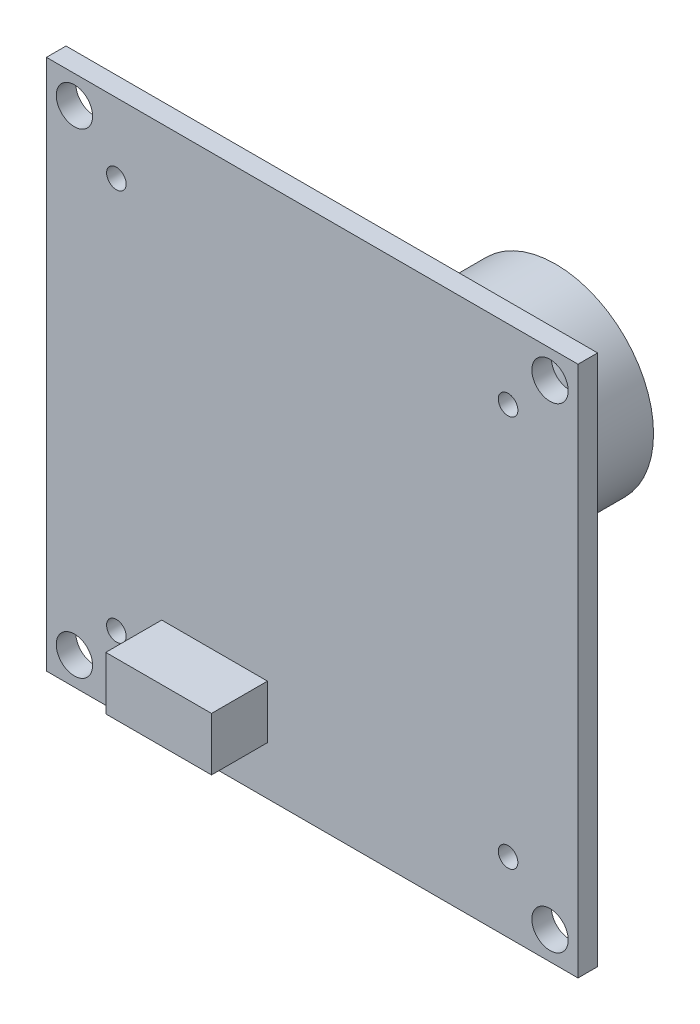
ISO-10303-21;
HEADER;
FILE_DESCRIPTION(('STEP AP214'),'2;1');
FILE_NAME('part.step','',(''),(''),'','','');
FILE_SCHEMA(('AUTOMOTIVE_DESIGN { 1 0 10303 214 1 1 1 1 }'));
ENDSEC;
DATA;
#1=APPLICATION_CONTEXT('core data for automotive mechanical design processes');
#2=APPLICATION_PROTOCOL_DEFINITION('international standard','automotive_design',2000,#1);
#3=PRODUCT_CONTEXT('',#1,'mechanical');
#4=PRODUCT('Part','Part','',(#3));
#5=PRODUCT_RELATED_PRODUCT_CATEGORY('part','',(#4));
#6=PRODUCT_DEFINITION_FORMATION('','',#4);
#7=PRODUCT_DEFINITION_CONTEXT('part definition',#1,'design');
#8=PRODUCT_DEFINITION('design','',#6,#7);
#9=PRODUCT_DEFINITION_SHAPE('','',#8);
#10=(LENGTH_UNIT() NAMED_UNIT(*) SI_UNIT(.MILLI.,.METRE.));
#11=(NAMED_UNIT(*) PLANE_ANGLE_UNIT() SI_UNIT($,.RADIAN.));
#12=(NAMED_UNIT(*) SI_UNIT($,.STERADIAN.) SOLID_ANGLE_UNIT());
#13=UNCERTAINTY_MEASURE_WITH_UNIT(LENGTH_MEASURE(1.E-05),#10,'distance_accuracy_value','');
#14=(GEOMETRIC_REPRESENTATION_CONTEXT(3) GLOBAL_UNCERTAINTY_ASSIGNED_CONTEXT((#13)) GLOBAL_UNIT_ASSIGNED_CONTEXT((#10,
#11,#12)) REPRESENTATION_CONTEXT('',''));
#15=CARTESIAN_POINT('',(0.,0.,0.));
#16=DIRECTION('',(0.,0.,1.));
#17=DIRECTION('',(1.,0.,0.));
#18=AXIS2_PLACEMENT_3D('',#15,#16,#17);
#19=CARTESIAN_POINT('',(0.,0.,1.4));
#20=DIRECTION('',(0.,0.,1.));
#21=DIRECTION('',(1.,0.,0.));
#22=AXIS2_PLACEMENT_3D('',#19,#20,#21);
#23=PLANE('',#22);
#24=CARTESIAN_POINT('',(-3.,-3.,1.4));
#25=DIRECTION('',(0.,0.,1.));
#26=DIRECTION('',(1.,0.,0.));
#27=AXIS2_PLACEMENT_3D('',#24,#25,#26);
#28=CIRCLE('',#27,1.3);
#29=CARTESIAN_POINT('',(-1.7,-3.,1.4));
#30=VERTEX_POINT('',#29);
#31=EDGE_CURVE('E136',#30,#30,#28,.T.);
#32=ORIENTED_EDGE('',*,*,#31,.F.);
#33=EDGE_LOOP('',(#32));
#34=FACE_BOUND('',#33,.T.);
#35=CARTESIAN_POINT('',(31.,-3.,1.4));
#36=DIRECTION('',(0.,0.,1.));
#37=DIRECTION('',(1.,0.,0.));
#38=AXIS2_PLACEMENT_3D('',#35,#36,#37);
#39=CIRCLE('',#38,1.3);
#40=CARTESIAN_POINT('',(32.3,-3.,1.4));
#41=VERTEX_POINT('',#40);
#42=EDGE_CURVE('E139',#41,#41,#39,.T.);
#43=ORIENTED_EDGE('',*,*,#42,.F.);
#44=EDGE_LOOP('',(#43));
#45=FACE_BOUND('',#44,.T.);
#46=CARTESIAN_POINT('',(31.,31.,1.4));
#47=DIRECTION('',(0.,0.,1.));
#48=DIRECTION('',(1.,0.,0.));
#49=AXIS2_PLACEMENT_3D('',#46,#47,#48);
#50=CIRCLE('',#49,1.3);
#51=CARTESIAN_POINT('',(32.3,31.,1.4));
#52=VERTEX_POINT('',#51);
#53=EDGE_CURVE('E143',#52,#52,#50,.T.);
#54=ORIENTED_EDGE('',*,*,#53,.F.);
#55=EDGE_LOOP('',(#54));
#56=FACE_BOUND('',#55,.T.);
#57=CARTESIAN_POINT('',(-3.,31.,1.4));
#58=DIRECTION('',(0.,0.,1.));
#59=DIRECTION('',(1.,0.,0.));
#60=AXIS2_PLACEMENT_3D('',#57,#58,#59);
#61=CIRCLE('',#60,1.3);
#62=CARTESIAN_POINT('',(-1.7,31.,1.4));
#63=VERTEX_POINT('',#62);
#64=EDGE_CURVE('E146',#63,#63,#61,.T.);
#65=ORIENTED_EDGE('',*,*,#64,.F.);
#66=EDGE_LOOP('',(#65));
#67=FACE_BOUND('',#66,.T.);
#68=DIRECTION('',(0.,-1.,0.));
#69=VECTOR('',#68,1.);
#70=CARTESIAN_POINT('',(33.,0.,1.4));
#71=LINE('',#70,#69);
#72=CARTESIAN_POINT('',(33.,33.,1.4));
#73=VERTEX_POINT('',#72);
#74=CARTESIAN_POINT('',(33.,-5.,1.4));
#75=VERTEX_POINT('',#74);
#76=EDGE_CURVE('E149',#73,#75,#71,.T.);
#77=ORIENTED_EDGE('',*,*,#76,.F.);
#78=DIRECTION('',(1.,0.,0.));
#79=VECTOR('',#78,1.);
#80=CARTESIAN_POINT('',(0.,33.,1.4));
#81=LINE('',#80,#79);
#82=CARTESIAN_POINT('',(-4.99999999999999,33.,1.4));
#83=VERTEX_POINT('',#82);
#84=EDGE_CURVE('E152',#83,#73,#81,.T.);
#85=ORIENTED_EDGE('',*,*,#84,.F.);
#86=DIRECTION('',(0.,-1.,0.));
#87=VECTOR('',#86,1.);
#88=CARTESIAN_POINT('',(-4.99999999999999,0.,1.4));
#89=LINE('',#88,#87);
#90=CARTESIAN_POINT('',(-4.99999999999999,-5.,1.4));
#91=VERTEX_POINT('',#90);
#92=EDGE_CURVE('E155',#83,#91,#89,.T.);
#93=ORIENTED_EDGE('',*,*,#92,.T.);
#94=DIRECTION('',(1.,0.,0.));
#95=VECTOR('',#94,1.);
#96=CARTESIAN_POINT('',(0.,-5.,1.4));
#97=LINE('',#96,#95);
#98=EDGE_CURVE('E158',#91,#75,#97,.T.);
#99=ORIENTED_EDGE('',*,*,#98,.T.);
#100=EDGE_LOOP('',(#77,#85,#93,#99));
#101=FACE_BOUND('',#100,.T.);
#102=CARTESIAN_POINT('',(0.,28.,1.4));
#103=DIRECTION('',(0.,0.,1.));
#104=DIRECTION('',(1.,0.,0.));
#105=AXIS2_PLACEMENT_3D('',#102,#103,#104);
#106=CIRCLE('',#105,0.7);
#107=CARTESIAN_POINT('',(0.7,28.,1.4));
#108=VERTEX_POINT('',#107);
#109=EDGE_CURVE('E160',#108,#108,#106,.T.);
#110=ORIENTED_EDGE('',*,*,#109,.F.);
#111=EDGE_LOOP('',(#110));
#112=FACE_BOUND('',#111,.T.);
#113=CARTESIAN_POINT('',(28.,28.,1.4));
#114=DIRECTION('',(0.,0.,1.));
#115=DIRECTION('',(1.,0.,0.));
#116=AXIS2_PLACEMENT_3D('',#113,#114,#115);
#117=CIRCLE('',#116,0.699999999999998);
#118=CARTESIAN_POINT('',(28.7,28.,1.4));
#119=VERTEX_POINT('',#118);
#120=EDGE_CURVE('E163',#119,#119,#117,.T.);
#121=ORIENTED_EDGE('',*,*,#120,.F.);
#122=EDGE_LOOP('',(#121));
#123=FACE_BOUND('',#122,.T.);
#124=CARTESIAN_POINT('',(0.,0.,1.4));
#125=DIRECTION('',(0.,0.,1.));
#126=DIRECTION('',(1.,0.,0.));
#127=AXIS2_PLACEMENT_3D('',#124,#125,#126);
#128=CIRCLE('',#127,0.7);
#129=CARTESIAN_POINT('',(0.7,0.,1.4));
#130=VERTEX_POINT('',#129);
#131=EDGE_CURVE('E166',#130,#130,#128,.T.);
#132=ORIENTED_EDGE('',*,*,#131,.F.);
#133=EDGE_LOOP('',(#132));
#134=FACE_BOUND('',#133,.T.);
#135=CARTESIAN_POINT('',(28.,0.,1.4));
#136=DIRECTION('',(0.,0.,1.));
#137=DIRECTION('',(1.,0.,0.));
#138=AXIS2_PLACEMENT_3D('',#135,#136,#137);
#139=CIRCLE('',#138,0.699999999999998);
#140=CARTESIAN_POINT('',(28.7,0.,1.4));
#141=VERTEX_POINT('',#140);
#142=EDGE_CURVE('E169',#141,#141,#139,.T.);
#143=ORIENTED_EDGE('',*,*,#142,.F.);
#144=EDGE_LOOP('',(#143));
#145=FACE_BOUND('',#144,.T.);
#146=DIRECTION('',(1.,0.,0.));
#147=VECTOR('',#146,1.);
#148=CARTESIAN_POINT('',(3.24000000000001,-1.53,1.4));
#149=LINE('',#148,#147);
#150=CARTESIAN_POINT('',(3.24000000000001,-1.53,1.4));
#151=VERTEX_POINT('',#150);
#152=CARTESIAN_POINT('',(10.8,-1.53,1.4));
#153=VERTEX_POINT('',#152);
#154=EDGE_CURVE('E55',#151,#153,#149,.T.);
#155=ORIENTED_EDGE('',*,*,#154,.F.);
#156=DIRECTION('',(0.,-1.,0.));
#157=VECTOR('',#156,1.);
#158=CARTESIAN_POINT('',(3.24000000000001,2.28,1.4));
#159=LINE('',#158,#157);
#160=CARTESIAN_POINT('',(3.24000000000001,2.28,1.4));
#161=VERTEX_POINT('',#160);
#162=EDGE_CURVE('E126',#161,#151,#159,.T.);
#163=ORIENTED_EDGE('',*,*,#162,.F.);
#164=DIRECTION('',(1.,0.,0.));
#165=VECTOR('',#164,1.);
#166=CARTESIAN_POINT('',(3.24000000000001,2.28,1.4));
#167=LINE('',#166,#165);
#168=CARTESIAN_POINT('',(10.8,2.28,1.4));
#169=VERTEX_POINT('',#168);
#170=EDGE_CURVE('E123',#161,#169,#167,.T.);
#171=ORIENTED_EDGE('',*,*,#170,.T.);
#172=DIRECTION('',(0.,-1.,0.));
#173=VECTOR('',#172,1.);
#174=CARTESIAN_POINT('',(10.8,2.28,1.4));
#175=LINE('',#174,#173);
#176=EDGE_CURVE('E60',#169,#153,#175,.T.);
#177=ORIENTED_EDGE('',*,*,#176,.T.);
#178=EDGE_LOOP('',(#155,#163,#171,#177));
#179=FACE_BOUND('',#178,.T.);
#180=ADVANCED_FACE('F40',(#34,#45,#56,#67,#101,#112,#123,#134,#145,#179),#23,.T.);
#181=CARTESIAN_POINT('',(33.,0.,1.4));
#182=DIRECTION('',(1.,0.,0.));
#183=DIRECTION('',(0.,0.,-1.));
#184=AXIS2_PLACEMENT_3D('',#181,#182,#183);
#185=PLANE('',#184);
#186=DIRECTION('',(0.,-1.,0.));
#187=VECTOR('',#186,1.);
#188=CARTESIAN_POINT('',(33.,0.,0.));
#189=LINE('',#188,#187);
#190=CARTESIAN_POINT('',(33.,33.,0.));
#191=VERTEX_POINT('',#190);
#192=CARTESIAN_POINT('',(33.,-5.,0.));
#193=VERTEX_POINT('',#192);
#194=EDGE_CURVE('E181',#191,#193,#189,.T.);
#195=ORIENTED_EDGE('',*,*,#194,.F.);
#196=DIRECTION('',(0.,0.,-1.));
#197=VECTOR('',#196,1.);
#198=CARTESIAN_POINT('',(33.,33.,1.4));
#199=LINE('',#198,#197);
#200=EDGE_CURVE('E48',#73,#191,#199,.T.);
#201=ORIENTED_EDGE('',*,*,#200,.F.);
#202=ORIENTED_EDGE('',*,*,#76,.T.);
#203=DIRECTION('',(0.,0.,-1.));
#204=VECTOR('',#203,1.);
#205=CARTESIAN_POINT('',(33.,-5.,1.4));
#206=LINE('',#205,#204);
#207=EDGE_CURVE('E171',#75,#193,#206,.T.);
#208=ORIENTED_EDGE('',*,*,#207,.T.);
#209=EDGE_LOOP('',(#195,#201,#202,#208));
#210=FACE_BOUND('',#209,.T.);
#211=ADVANCED_FACE('F216',(#210),#185,.T.);
#212=CARTESIAN_POINT('',(0.,33.,1.4));
#213=DIRECTION('',(0.,1.,0.));
#214=DIRECTION('',(0.,0.,1.));
#215=AXIS2_PLACEMENT_3D('',#212,#213,#214);
#216=PLANE('',#215);
#217=DIRECTION('',(1.,0.,0.));
#218=VECTOR('',#217,1.);
#219=CARTESIAN_POINT('',(0.,33.,0.));
#220=LINE('',#219,#218);
#221=CARTESIAN_POINT('',(-4.99999999999999,33.,0.));
#222=VERTEX_POINT('',#221);
#223=EDGE_CURVE('E184',#222,#191,#220,.T.);
#224=ORIENTED_EDGE('',*,*,#223,.F.);
#225=DIRECTION('',(0.,0.,-1.));
#226=VECTOR('',#225,1.);
#227=CARTESIAN_POINT('',(-4.99999999999999,33.,1.4));
#228=LINE('',#227,#226);
#229=EDGE_CURVE('E208',#83,#222,#228,.T.);
#230=ORIENTED_EDGE('',*,*,#229,.F.);
#231=ORIENTED_EDGE('',*,*,#84,.T.);
#232=ORIENTED_EDGE('',*,*,#200,.T.);
#233=EDGE_LOOP('',(#224,#230,#231,#232));
#234=FACE_BOUND('',#233,.T.);
#235=ADVANCED_FACE('F212',(#234),#216,.T.);
#236=CARTESIAN_POINT('',(-4.99999999999999,0.,1.4));
#237=DIRECTION('',(1.,0.,0.));
#238=DIRECTION('',(0.,0.,-1.));
#239=AXIS2_PLACEMENT_3D('',#236,#237,#238);
#240=PLANE('',#239);
#241=DIRECTION('',(0.,-1.,0.));
#242=VECTOR('',#241,1.);
#243=CARTESIAN_POINT('',(-4.99999999999999,0.,0.));
#244=LINE('',#243,#242);
#245=CARTESIAN_POINT('',(-4.99999999999999,-5.,0.));
#246=VERTEX_POINT('',#245);
#247=EDGE_CURVE('E187',#222,#246,#244,.T.);
#248=ORIENTED_EDGE('',*,*,#247,.T.);
#249=DIRECTION('',(0.,0.,-1.));
#250=VECTOR('',#249,1.);
#251=CARTESIAN_POINT('',(-4.99999999999999,-5.,1.4));
#252=LINE('',#251,#250);
#253=EDGE_CURVE('E205',#91,#246,#252,.T.);
#254=ORIENTED_EDGE('',*,*,#253,.F.);
#255=ORIENTED_EDGE('',*,*,#92,.F.);
#256=ORIENTED_EDGE('',*,*,#229,.T.);
#257=EDGE_LOOP('',(#248,#254,#255,#256));
#258=FACE_BOUND('',#257,.T.);
#259=ADVANCED_FACE('F224',(#258),#240,.F.);
#260=CARTESIAN_POINT('',(0.,0.,1.4));
#261=DIRECTION('',(0.,0.,-1.));
#262=DIRECTION('',(-1.,0.,0.));
#263=AXIS2_PLACEMENT_3D('',#260,#261,#262);
#264=CYLINDRICAL_SURFACE('',#263,0.7);
#265=ORIENTED_EDGE('',*,*,#131,.T.);
#266=EDGE_LOOP('',(#265));
#267=FACE_BOUND('',#266,.T.);
#268=CARTESIAN_POINT('',(0.,0.,0.));
#269=DIRECTION('',(0.,0.,1.));
#270=DIRECTION('',(1.,0.,0.));
#271=AXIS2_PLACEMENT_3D('',#268,#269,#270);
#272=CIRCLE('',#271,0.7);
#273=CARTESIAN_POINT('',(0.7,0.,0.));
#274=VERTEX_POINT('',#273);
#275=EDGE_CURVE('E199',#274,#274,#272,.T.);
#276=ORIENTED_EDGE('',*,*,#275,.F.);
#277=EDGE_LOOP('',(#276));
#278=FACE_BOUND('',#277,.T.);
#279=ADVANCED_FACE('F264',(#267,#278),#264,.F.);
#280=CARTESIAN_POINT('',(28.,28.,1.4));
#281=DIRECTION('',(0.,0.,-1.));
#282=DIRECTION('',(-1.,0.,0.));
#283=AXIS2_PLACEMENT_3D('',#280,#281,#282);
#284=CYLINDRICAL_SURFACE('',#283,0.699999999999998);
#285=ORIENTED_EDGE('',*,*,#120,.T.);
#286=EDGE_LOOP('',(#285));
#287=FACE_BOUND('',#286,.T.);
#288=CARTESIAN_POINT('',(28.,28.,0.));
#289=DIRECTION('',(0.,0.,1.));
#290=DIRECTION('',(1.,0.,0.));
#291=AXIS2_PLACEMENT_3D('',#288,#289,#290);
#292=CIRCLE('',#291,0.699999999999998);
#293=CARTESIAN_POINT('',(28.7,28.,0.));
#294=VERTEX_POINT('',#293);
#295=EDGE_CURVE('E196',#294,#294,#292,.T.);
#296=ORIENTED_EDGE('',*,*,#295,.F.);
#297=EDGE_LOOP('',(#296));
#298=FACE_BOUND('',#297,.T.);
#299=ADVANCED_FACE('F241',(#287,#298),#284,.F.);
#300=CARTESIAN_POINT('',(0.,28.,1.4));
#301=DIRECTION('',(0.,0.,-1.));
#302=DIRECTION('',(-1.,0.,0.));
#303=AXIS2_PLACEMENT_3D('',#300,#301,#302);
#304=CYLINDRICAL_SURFACE('',#303,0.7);
#305=ORIENTED_EDGE('',*,*,#109,.T.);
#306=EDGE_LOOP('',(#305));
#307=FACE_BOUND('',#306,.T.);
#308=CARTESIAN_POINT('',(0.,28.,0.));
#309=DIRECTION('',(0.,0.,1.));
#310=DIRECTION('',(1.,0.,0.));
#311=AXIS2_PLACEMENT_3D('',#308,#309,#310);
#312=CIRCLE('',#311,0.7);
#313=CARTESIAN_POINT('',(0.7,28.,0.));
#314=VERTEX_POINT('',#313);
#315=EDGE_CURVE('E193',#314,#314,#312,.T.);
#316=ORIENTED_EDGE('',*,*,#315,.F.);
#317=EDGE_LOOP('',(#316));
#318=FACE_BOUND('',#317,.T.);
#319=ADVANCED_FACE('F232',(#307,#318),#304,.F.);
#320=CARTESIAN_POINT('',(0.,-5.,1.4));
#321=DIRECTION('',(0.,1.,0.));
#322=DIRECTION('',(0.,0.,1.));
#323=AXIS2_PLACEMENT_3D('',#320,#321,#322);
#324=PLANE('',#323);
#325=DIRECTION('',(1.,0.,0.));
#326=VECTOR('',#325,1.);
#327=CARTESIAN_POINT('',(0.,-5.,0.));
#328=LINE('',#327,#326);
#329=EDGE_CURVE('E190',#246,#193,#328,.T.);
#330=ORIENTED_EDGE('',*,*,#329,.T.);
#331=ORIENTED_EDGE('',*,*,#207,.F.);
#332=ORIENTED_EDGE('',*,*,#98,.F.);
#333=ORIENTED_EDGE('',*,*,#253,.T.);
#334=EDGE_LOOP('',(#330,#331,#332,#333));
#335=FACE_BOUND('',#334,.T.);
#336=ADVANCED_FACE('F229',(#335),#324,.F.);
#337=CARTESIAN_POINT('',(-3.,31.,1.4));
#338=DIRECTION('',(0.,0.,-1.));
#339=DIRECTION('',(-1.,0.,0.));
#340=AXIS2_PLACEMENT_3D('',#337,#338,#339);
#341=CYLINDRICAL_SURFACE('',#340,1.3);
#342=ORIENTED_EDGE('',*,*,#64,.T.);
#343=EDGE_LOOP('',(#342));
#344=FACE_BOUND('',#343,.T.);
#345=CARTESIAN_POINT('',(-3.,31.,0.));
#346=DIRECTION('',(0.,0.,1.));
#347=DIRECTION('',(1.,0.,0.));
#348=AXIS2_PLACEMENT_3D('',#345,#346,#347);
#349=CIRCLE('',#348,1.3);
#350=CARTESIAN_POINT('',(-1.7,31.,0.));
#351=VERTEX_POINT('',#350);
#352=EDGE_CURVE('E178',#351,#351,#349,.T.);
#353=ORIENTED_EDGE('',*,*,#352,.F.);
#354=EDGE_LOOP('',(#353));
#355=FACE_BOUND('',#354,.T.);
#356=ADVANCED_FACE('F231',(#344,#355),#341,.F.);
#357=CARTESIAN_POINT('',(31.,31.,1.4));
#358=DIRECTION('',(0.,0.,-1.));
#359=DIRECTION('',(-1.,0.,0.));
#360=AXIS2_PLACEMENT_3D('',#357,#358,#359);
#361=CYLINDRICAL_SURFACE('',#360,1.3);
#362=ORIENTED_EDGE('',*,*,#53,.T.);
#363=EDGE_LOOP('',(#362));
#364=FACE_BOUND('',#363,.T.);
#365=CARTESIAN_POINT('',(31.,31.,0.));
#366=DIRECTION('',(0.,0.,1.));
#367=DIRECTION('',(1.,0.,0.));
#368=AXIS2_PLACEMENT_3D('',#365,#366,#367);
#369=CIRCLE('',#368,1.3);
#370=CARTESIAN_POINT('',(32.3,31.,0.));
#371=VERTEX_POINT('',#370);
#372=EDGE_CURVE('E175',#371,#371,#369,.T.);
#373=ORIENTED_EDGE('',*,*,#372,.F.);
#374=EDGE_LOOP('',(#373));
#375=FACE_BOUND('',#374,.T.);
#376=ADVANCED_FACE('F238',(#364,#375),#361,.F.);
#377=CARTESIAN_POINT('',(31.,-3.,1.4));
#378=DIRECTION('',(0.,0.,-1.));
#379=DIRECTION('',(-1.,0.,0.));
#380=AXIS2_PLACEMENT_3D('',#377,#378,#379);
#381=CYLINDRICAL_SURFACE('',#380,1.3);
#382=ORIENTED_EDGE('',*,*,#42,.T.);
#383=EDGE_LOOP('',(#382));
#384=FACE_BOUND('',#383,.T.);
#385=CARTESIAN_POINT('',(31.,-3.,0.));
#386=DIRECTION('',(0.,0.,1.));
#387=DIRECTION('',(1.,0.,0.));
#388=AXIS2_PLACEMENT_3D('',#385,#386,#387);
#389=CIRCLE('',#388,1.3);
#390=CARTESIAN_POINT('',(32.3,-3.,0.));
#391=VERTEX_POINT('',#390);
#392=EDGE_CURVE('E130',#391,#391,#389,.T.);
#393=ORIENTED_EDGE('',*,*,#392,.F.);
#394=EDGE_LOOP('',(#393));
#395=FACE_BOUND('',#394,.T.);
#396=ADVANCED_FACE('F316',(#384,#395),#381,.F.);
#397=CARTESIAN_POINT('',(-3.,-3.,1.4));
#398=DIRECTION('',(0.,0.,-1.));
#399=DIRECTION('',(-1.,0.,0.));
#400=AXIS2_PLACEMENT_3D('',#397,#398,#399);
#401=CYLINDRICAL_SURFACE('',#400,1.3);
#402=ORIENTED_EDGE('',*,*,#31,.T.);
#403=EDGE_LOOP('',(#402));
#404=FACE_BOUND('',#403,.T.);
#405=CARTESIAN_POINT('',(-3.,-3.,0.));
#406=DIRECTION('',(0.,0.,1.));
#407=DIRECTION('',(1.,0.,0.));
#408=AXIS2_PLACEMENT_3D('',#405,#406,#407);
#409=CIRCLE('',#408,1.3);
#410=CARTESIAN_POINT('',(-1.7,-3.,0.));
#411=VERTEX_POINT('',#410);
#412=EDGE_CURVE('E127',#411,#411,#409,.T.);
#413=ORIENTED_EDGE('',*,*,#412,.F.);
#414=EDGE_LOOP('',(#413));
#415=FACE_BOUND('',#414,.T.);
#416=ADVANCED_FACE('F42',(#404,#415),#401,.F.);
#417=CARTESIAN_POINT('',(28.,0.,1.4));
#418=DIRECTION('',(0.,0.,-1.));
#419=DIRECTION('',(-1.,0.,0.));
#420=AXIS2_PLACEMENT_3D('',#417,#418,#419);
#421=CYLINDRICAL_SURFACE('',#420,0.699999999999998);
#422=ORIENTED_EDGE('',*,*,#142,.T.);
#423=EDGE_LOOP('',(#422));
#424=FACE_BOUND('',#423,.T.);
#425=CARTESIAN_POINT('',(28.,0.,0.));
#426=DIRECTION('',(0.,0.,1.));
#427=DIRECTION('',(1.,0.,0.));
#428=AXIS2_PLACEMENT_3D('',#425,#426,#427);
#429=CIRCLE('',#428,0.699999999999998);
#430=CARTESIAN_POINT('',(28.7,0.,0.));
#431=VERTEX_POINT('',#430);
#432=EDGE_CURVE('E140',#431,#431,#429,.T.);
#433=ORIENTED_EDGE('',*,*,#432,.F.);
#434=EDGE_LOOP('',(#433));
#435=FACE_BOUND('',#434,.T.);
#436=ADVANCED_FACE('F259',(#424,#435),#421,.F.);
#437=CARTESIAN_POINT('',(0.,0.,0.));
#438=DIRECTION('',(0.,0.,1.));
#439=DIRECTION('',(1.,0.,0.));
#440=AXIS2_PLACEMENT_3D('',#437,#438,#439);
#441=PLANE('',#440);
#442=CARTESIAN_POINT('',(14.,14.,0.));
#443=DIRECTION('',(0.,0.,1.));
#444=DIRECTION('',(1.,0.,0.));
#445=AXIS2_PLACEMENT_3D('',#442,#443,#444);
#446=CIRCLE('',#445,7.);
#447=CARTESIAN_POINT('',(21.,14.,0.));
#448=VERTEX_POINT('',#447);
#449=EDGE_CURVE('E11',#448,#448,#446,.F.);
#450=ORIENTED_EDGE('',*,*,#449,.F.);
#451=EDGE_LOOP('',(#450));
#452=FACE_BOUND('',#451,.T.);
#453=ORIENTED_EDGE('',*,*,#412,.T.);
#454=EDGE_LOOP('',(#453));
#455=FACE_BOUND('',#454,.T.);
#456=ORIENTED_EDGE('',*,*,#392,.T.);
#457=EDGE_LOOP('',(#456));
#458=FACE_BOUND('',#457,.T.);
#459=ORIENTED_EDGE('',*,*,#372,.T.);
#460=EDGE_LOOP('',(#459));
#461=FACE_BOUND('',#460,.T.);
#462=ORIENTED_EDGE('',*,*,#352,.T.);
#463=EDGE_LOOP('',(#462));
#464=FACE_BOUND('',#463,.T.);
#465=ORIENTED_EDGE('',*,*,#194,.T.);
#466=ORIENTED_EDGE('',*,*,#329,.F.);
#467=ORIENTED_EDGE('',*,*,#247,.F.);
#468=ORIENTED_EDGE('',*,*,#223,.T.);
#469=EDGE_LOOP('',(#465,#466,#467,#468));
#470=FACE_BOUND('',#469,.T.);
#471=ORIENTED_EDGE('',*,*,#315,.T.);
#472=EDGE_LOOP('',(#471));
#473=FACE_BOUND('',#472,.T.);
#474=ORIENTED_EDGE('',*,*,#295,.T.);
#475=EDGE_LOOP('',(#474));
#476=FACE_BOUND('',#475,.T.);
#477=ORIENTED_EDGE('',*,*,#275,.T.);
#478=EDGE_LOOP('',(#477));
#479=FACE_BOUND('',#478,.T.);
#480=ORIENTED_EDGE('',*,*,#432,.T.);
#481=EDGE_LOOP('',(#480));
#482=FACE_BOUND('',#481,.T.);
#483=ADVANCED_FACE('F220',(#452,#455,#458,#461,#464,#470,#473,#476,#479,#482),#441,.F.);
#484=CARTESIAN_POINT('',(3.24000000000001,2.28,5.4));
#485=DIRECTION('',(1.,0.,0.));
#486=DIRECTION('',(0.,1.,0.));
#487=AXIS2_PLACEMENT_3D('',#484,#485,#486);
#488=PLANE('',#487);
#489=ORIENTED_EDGE('',*,*,#162,.T.);
#490=DIRECTION('',(0.,0.,-1.));
#491=VECTOR('',#490,1.);
#492=CARTESIAN_POINT('',(3.24000000000001,-1.53,5.4));
#493=LINE('',#492,#491);
#494=CARTESIAN_POINT('',(3.24000000000001,-1.53,5.4));
#495=VERTEX_POINT('',#494);
#496=EDGE_CURVE('E107',#495,#151,#493,.T.);
#497=ORIENTED_EDGE('',*,*,#496,.F.);
#498=DIRECTION('',(0.,-1.,0.));
#499=VECTOR('',#498,1.);
#500=CARTESIAN_POINT('',(3.24000000000001,2.28,5.4));
#501=LINE('',#500,#499);
#502=CARTESIAN_POINT('',(3.24000000000001,2.28,5.4));
#503=VERTEX_POINT('',#502);
#504=EDGE_CURVE('E114',#503,#495,#501,.T.);
#505=ORIENTED_EDGE('',*,*,#504,.F.);
#506=DIRECTION('',(0.,0.,-1.));
#507=VECTOR('',#506,1.);
#508=CARTESIAN_POINT('',(3.24000000000001,2.28,5.4));
#509=LINE('',#508,#507);
#510=EDGE_CURVE('E443',#503,#161,#509,.T.);
#511=ORIENTED_EDGE('',*,*,#510,.T.);
#512=EDGE_LOOP('',(#489,#497,#505,#511));
#513=FACE_BOUND('',#512,.T.);
#514=ADVANCED_FACE('F125',(#513),#488,.F.);
#515=CARTESIAN_POINT('',(3.24000000000001,-1.53,5.4));
#516=DIRECTION('',(0.,1.,0.));
#517=DIRECTION('',(0.,0.,1.));
#518=AXIS2_PLACEMENT_3D('',#515,#516,#517);
#519=PLANE('',#518);
#520=ORIENTED_EDGE('',*,*,#154,.T.);
#521=DIRECTION('',(0.,0.,-1.));
#522=VECTOR('',#521,1.);
#523=CARTESIAN_POINT('',(10.8,-1.53,5.4));
#524=LINE('',#523,#522);
#525=CARTESIAN_POINT('',(10.8,-1.53,5.4));
#526=VERTEX_POINT('',#525);
#527=EDGE_CURVE('E109',#526,#153,#524,.T.);
#528=ORIENTED_EDGE('',*,*,#527,.F.);
#529=DIRECTION('',(1.,0.,0.));
#530=VECTOR('',#529,1.);
#531=CARTESIAN_POINT('',(3.24000000000001,-1.53,5.4));
#532=LINE('',#531,#530);
#533=EDGE_CURVE('E103',#495,#526,#532,.T.);
#534=ORIENTED_EDGE('',*,*,#533,.F.);
#535=ORIENTED_EDGE('',*,*,#496,.T.);
#536=EDGE_LOOP('',(#520,#528,#534,#535));
#537=FACE_BOUND('',#536,.T.);
#538=ADVANCED_FACE('F105',(#537),#519,.F.);
#539=CARTESIAN_POINT('',(10.8,2.28,5.4));
#540=DIRECTION('',(1.,0.,0.));
#541=DIRECTION('',(0.,0.,-1.));
#542=AXIS2_PLACEMENT_3D('',#539,#540,#541);
#543=PLANE('',#542);
#544=ORIENTED_EDGE('',*,*,#176,.F.);
#545=DIRECTION('',(0.,0.,-1.));
#546=VECTOR('',#545,1.);
#547=CARTESIAN_POINT('',(10.8,2.28,5.4));
#548=LINE('',#547,#546);
#549=CARTESIAN_POINT('',(10.8,2.28,5.4));
#550=VERTEX_POINT('',#549);
#551=EDGE_CURVE('E132',#550,#169,#548,.T.);
#552=ORIENTED_EDGE('',*,*,#551,.F.);
#553=DIRECTION('',(0.,-1.,0.));
#554=VECTOR('',#553,1.);
#555=CARTESIAN_POINT('',(10.8,2.28,5.4));
#556=LINE('',#555,#554);
#557=EDGE_CURVE('E113',#550,#526,#556,.T.);
#558=ORIENTED_EDGE('',*,*,#557,.T.);
#559=ORIENTED_EDGE('',*,*,#527,.T.);
#560=EDGE_LOOP('',(#544,#552,#558,#559));
#561=FACE_BOUND('',#560,.T.);
#562=ADVANCED_FACE('F366',(#561),#543,.T.);
#563=CARTESIAN_POINT('',(3.24000000000001,2.28,5.4));
#564=DIRECTION('',(0.,1.,0.));
#565=DIRECTION('',(-1.,0.,0.));
#566=AXIS2_PLACEMENT_3D('',#563,#564,#565);
#567=PLANE('',#566);
#568=ORIENTED_EDGE('',*,*,#170,.F.);
#569=ORIENTED_EDGE('',*,*,#510,.F.);
#570=DIRECTION('',(1.,0.,0.));
#571=VECTOR('',#570,1.);
#572=CARTESIAN_POINT('',(3.24000000000001,2.28,5.4));
#573=LINE('',#572,#571);
#574=EDGE_CURVE('E120',#503,#550,#573,.T.);
#575=ORIENTED_EDGE('',*,*,#574,.T.);
#576=ORIENTED_EDGE('',*,*,#551,.T.);
#577=EDGE_LOOP('',(#568,#569,#575,#576));
#578=FACE_BOUND('',#577,.T.);
#579=ADVANCED_FACE('F375',(#578),#567,.T.);
#580=CARTESIAN_POINT('',(0.,0.,5.4));
#581=DIRECTION('',(0.,0.,1.));
#582=DIRECTION('',(1.,0.,0.));
#583=AXIS2_PLACEMENT_3D('',#580,#581,#582);
#584=PLANE('',#583);
#585=ORIENTED_EDGE('',*,*,#504,.T.);
#586=ORIENTED_EDGE('',*,*,#533,.T.);
#587=ORIENTED_EDGE('',*,*,#557,.F.);
#588=ORIENTED_EDGE('',*,*,#574,.F.);
#589=EDGE_LOOP('',(#585,#586,#587,#588));
#590=FACE_BOUND('',#589,.T.);
#591=ADVANCED_FACE('F118',(#590),#584,.T.);
#592=CARTESIAN_POINT('',(14.,14.,-16.));
#593=DIRECTION('',(0.,0.,1.));
#594=DIRECTION('',(1.,0.,0.));
#595=AXIS2_PLACEMENT_3D('',#592,#593,#594);
#596=CYLINDRICAL_SURFACE('',#595,7.);
#597=CARTESIAN_POINT('',(14.,14.,-16.));
#598=DIRECTION('',(0.,0.,-1.));
#599=DIRECTION('',(-1.,0.,0.));
#600=AXIS2_PLACEMENT_3D('',#597,#598,#599);
#601=CIRCLE('',#600,7.);
#602=CARTESIAN_POINT('',(7.00000000000001,14.,-16.));
#603=VERTEX_POINT('',#602);
#604=EDGE_CURVE('E438',#603,#603,#601,.T.);
#605=ORIENTED_EDGE('',*,*,#604,.F.);
#606=EDGE_LOOP('',(#605));
#607=FACE_BOUND('',#606,.T.);
#608=ORIENTED_EDGE('',*,*,#449,.T.);
#609=EDGE_LOOP('',(#608));
#610=FACE_BOUND('',#609,.T.);
#611=ADVANCED_FACE('F396',(#607,#610),#596,.T.);
#612=CARTESIAN_POINT('',(14.,14.,-16.));
#613=DIRECTION('',(0.,0.,-1.));
#614=DIRECTION('',(-1.,0.,0.));
#615=AXIS2_PLACEMENT_3D('',#612,#613,#614);
#616=PLANE('',#615);
#617=ORIENTED_EDGE('',*,*,#604,.T.);
#618=EDGE_LOOP('',(#617));
#619=FACE_BOUND('',#618,.T.);
#620=ADVANCED_FACE('F413',(#619),#616,.T.);
#621=CLOSED_SHELL('',(#180,#211,#235,#259,#279,#299,#319,#336,#356,#376,#396,#416,#436,#483,
#514,#538,#562,#579,#591,#611,#620));
#622=MANIFOLD_SOLID_BREP('B2',#621);
#623=ADVANCED_BREP_SHAPE_REPRESENTATION('',(#18,#622),#14);
#624=SHAPE_DEFINITION_REPRESENTATION(#9,#623);
ENDSEC;
END-ISO-10303-21;
